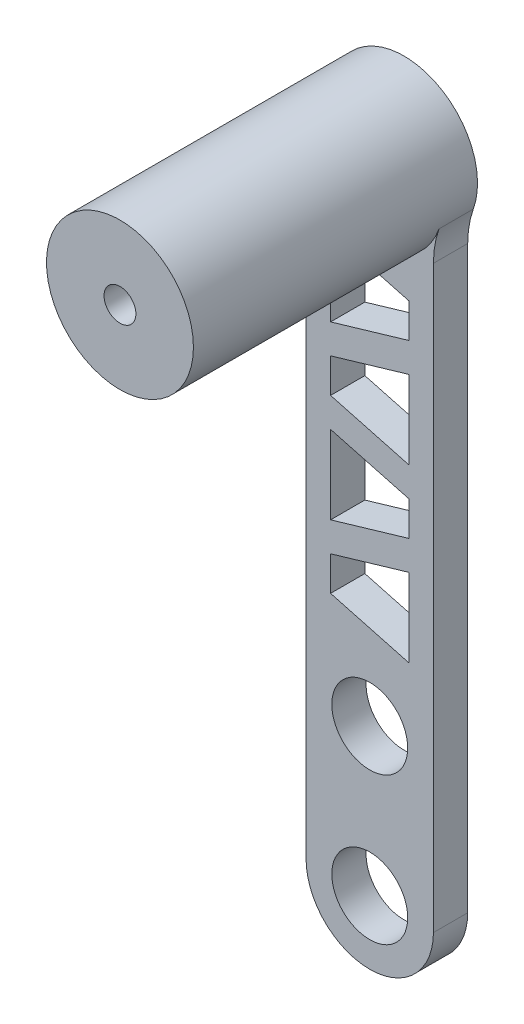
ISO-10303-21;
HEADER;
FILE_DESCRIPTION(('STEP AP214'),'2;1');
FILE_NAME('part.step','',(''),(''),'','','');
FILE_SCHEMA(('AUTOMOTIVE_DESIGN { 1 0 10303 214 1 1 1 1 }'));
ENDSEC;
DATA;
#1=APPLICATION_CONTEXT('core data for automotive mechanical design processes');
#2=APPLICATION_PROTOCOL_DEFINITION('international standard','automotive_design',2000,#1);
#3=PRODUCT_CONTEXT('',#1,'mechanical');
#4=PRODUCT('Part','Part','',(#3));
#5=PRODUCT_RELATED_PRODUCT_CATEGORY('part','',(#4));
#6=PRODUCT_DEFINITION_FORMATION('','',#4);
#7=PRODUCT_DEFINITION_CONTEXT('part definition',#1,'design');
#8=PRODUCT_DEFINITION('design','',#6,#7);
#9=PRODUCT_DEFINITION_SHAPE('','',#8);
#10=(LENGTH_UNIT() NAMED_UNIT(*) SI_UNIT(.MILLI.,.METRE.));
#11=(NAMED_UNIT(*) PLANE_ANGLE_UNIT() SI_UNIT($,.RADIAN.));
#12=(NAMED_UNIT(*) SI_UNIT($,.STERADIAN.) SOLID_ANGLE_UNIT());
#13=UNCERTAINTY_MEASURE_WITH_UNIT(LENGTH_MEASURE(1.E-05),#10,'distance_accuracy_value','');
#14=(GEOMETRIC_REPRESENTATION_CONTEXT(3) GLOBAL_UNCERTAINTY_ASSIGNED_CONTEXT((#13)) GLOBAL_UNIT_ASSIGNED_CONTEXT((#10,
#11,#12)) REPRESENTATION_CONTEXT('',''));
#15=CARTESIAN_POINT('',(0.,0.,0.));
#16=DIRECTION('',(0.,0.,1.));
#17=DIRECTION('',(1.,0.,0.));
#18=AXIS2_PLACEMENT_3D('',#15,#16,#17);
#19=CARTESIAN_POINT('',(31.8782180609369,65.8173692325044,7.));
#20=DIRECTION('',(0.,0.,-1.));
#21=DIRECTION('',(-1.,0.,0.));
#22=AXIS2_PLACEMENT_3D('',#19,#20,#21);
#23=PLANE('',#22);
#24=DIRECTION('',(0.,1.,0.));
#25=VECTOR('',#24,1.);
#26=CARTESIAN_POINT('',(6.8782180609373,14.6704669103968,7.));
#27=LINE('',#26,#25);
#28=CARTESIAN_POINT('',(6.8782180609373,14.6704669103968,7.));
#29=VERTEX_POINT('',#28);
#30=CARTESIAN_POINT('',(6.8782180609373,21.6704669103968,7.));
#31=VERTEX_POINT('',#30);
#32=EDGE_CURVE('E215',#29,#31,#27,.T.);
#33=ORIENTED_EDGE('',*,*,#32,.F.);
#34=DIRECTION('',(0.959252946392428,0.28254873002271,0.));
#35=VECTOR('',#34,1.);
#36=CARTESIAN_POINT('',(-9.1217819390627,9.95765398929479,7.));
#37=LINE('',#36,#35);
#38=CARTESIAN_POINT('',(-9.1217819390627,9.95765398929479,7.));
#39=VERTEX_POINT('',#38);
#40=EDGE_CURVE('E222',#39,#29,#37,.T.);
#41=ORIENTED_EDGE('',*,*,#40,.F.);
#42=DIRECTION('',(0.,-1.,0.));
#43=VECTOR('',#42,1.);
#44=CARTESIAN_POINT('',(-9.12178193906271,25.9576539892948,7.));
#45=LINE('',#44,#43);
#46=CARTESIAN_POINT('',(-9.12178193906271,25.9576539892948,7.));
#47=VERTEX_POINT('',#46);
#48=EDGE_CURVE('E220',#47,#39,#45,.T.);
#49=ORIENTED_EDGE('',*,*,#48,.F.);
#50=DIRECTION('',(-0.965925826289067,0.258819045102525,0.));
#51=VECTOR('',#50,1.);
#52=CARTESIAN_POINT('',(6.8782180609373,21.6704669103968,7.));
#53=LINE('',#52,#51);
#54=EDGE_CURVE('E217',#31,#47,#53,.T.);
#55=ORIENTED_EDGE('',*,*,#54,.F.);
#56=EDGE_LOOP('',(#33,#41,#49,#55));
#57=FACE_BOUND('',#56,.T.);
#58=DIRECTION('',(-0.959252946392428,-0.28254873002271,0.));
#59=VECTOR('',#58,1.);
#60=CARTESIAN_POINT('',(6.87821806093681,43.6704669103968,7.));
#61=LINE('',#60,#59);
#62=CARTESIAN_POINT('',(6.87821806093681,43.6704669103968,7.));
#63=VERTEX_POINT('',#62);
#64=CARTESIAN_POINT('',(-9.12178193906319,38.9576539892948,7.));
#65=VERTEX_POINT('',#64);
#66=EDGE_CURVE('E272',#63,#65,#61,.T.);
#67=ORIENTED_EDGE('',*,*,#66,.F.);
#68=DIRECTION('',(0.,1.,0.));
#69=VECTOR('',#68,1.);
#70=CARTESIAN_POINT('',(6.87821806093681,27.6704669103968,7.));
#71=LINE('',#70,#69);
#72=CARTESIAN_POINT('',(6.87821806093681,27.6704669103968,7.));
#73=VERTEX_POINT('',#72);
#74=EDGE_CURVE('E280',#73,#63,#71,.T.);
#75=ORIENTED_EDGE('',*,*,#74,.F.);
#76=DIRECTION('',(0.965925826289067,-0.258819045102525,0.));
#77=VECTOR('',#76,1.);
#78=CARTESIAN_POINT('',(-9.12178193906319,31.9576539892948,7.));
#79=LINE('',#78,#77);
#80=CARTESIAN_POINT('',(-9.12178193906319,31.9576539892948,7.));
#81=VERTEX_POINT('',#80);
#82=EDGE_CURVE('E277',#81,#73,#79,.T.);
#83=ORIENTED_EDGE('',*,*,#82,.F.);
#84=DIRECTION('',(0.,-1.,0.));
#85=VECTOR('',#84,1.);
#86=CARTESIAN_POINT('',(-9.12178193906319,38.9576539892948,7.));
#87=LINE('',#86,#85);
#88=EDGE_CURVE('E274',#65,#81,#87,.T.);
#89=ORIENTED_EDGE('',*,*,#88,.F.);
#90=EDGE_LOOP('',(#67,#75,#83,#89));
#91=FACE_BOUND('',#90,.T.);
#92=CARTESIAN_POINT('',(-1.12178193906306,-22.5207269778051,7.));
#93=DIRECTION('',(0.,0.,1.));
#94=DIRECTION('',(1.,0.,0.));
#95=AXIS2_PLACEMENT_3D('',#92,#93,#94);
#96=CIRCLE('',#95,7.75);
#97=CARTESIAN_POINT('',(6.62821806093695,-22.5207269778051,7.));
#98=VERTEX_POINT('',#97);
#99=EDGE_CURVE('E339',#98,#98,#96,.T.);
#100=ORIENTED_EDGE('',*,*,#99,.F.);
#101=EDGE_LOOP('',(#100));
#102=FACE_BOUND('',#101,.T.);
#103=CARTESIAN_POINT('',(-1.12178193906305,-52.5207269778051,7.));
#104=DIRECTION('',(0.,0.,1.));
#105=DIRECTION('',(1.,0.,0.));
#106=AXIS2_PLACEMENT_3D('',#103,#104,#105);
#107=CIRCLE('',#106,7.75);
#108=CARTESIAN_POINT('',(6.62821806093695,-52.5207269778051,7.));
#109=VERTEX_POINT('',#108);
#110=EDGE_CURVE('E345',#109,#109,#107,.T.);
#111=ORIENTED_EDGE('',*,*,#110,.F.);
#112=EDGE_LOOP('',(#111));
#113=FACE_BOUND('',#112,.T.);
#114=DIRECTION('',(-0.959252946392428,-0.28254873002271,0.));
#115=VECTOR('',#114,1.);
#116=CARTESIAN_POINT('',(6.87821806093693,8.67046691039676,7.));
#117=LINE('',#116,#115);
#118=CARTESIAN_POINT('',(6.87821806093693,8.67046691039676,7.));
#119=VERTEX_POINT('',#118);
#120=CARTESIAN_POINT('',(-9.12178193906307,3.95765398929479,7.));
#121=VERTEX_POINT('',#120);
#122=EDGE_CURVE('E303',#119,#121,#117,.T.);
#123=ORIENTED_EDGE('',*,*,#122,.F.);
#124=DIRECTION('',(0.,1.,0.));
#125=VECTOR('',#124,1.);
#126=CARTESIAN_POINT('',(6.87821806093693,-7.32953308960324,7.));
#127=LINE('',#126,#125);
#128=CARTESIAN_POINT('',(6.87821806093693,-7.32953308960324,7.));
#129=VERTEX_POINT('',#128);
#130=EDGE_CURVE('E311',#129,#119,#127,.T.);
#131=ORIENTED_EDGE('',*,*,#130,.F.);
#132=DIRECTION('',(0.965925826289067,-0.258819045102525,0.));
#133=VECTOR('',#132,1.);
#134=CARTESIAN_POINT('',(-9.12178193906307,-3.04234601070521,7.));
#135=LINE('',#134,#133);
#136=CARTESIAN_POINT('',(-9.12178193906307,-3.04234601070521,7.));
#137=VERTEX_POINT('',#136);
#138=EDGE_CURVE('E308',#137,#129,#135,.T.);
#139=ORIENTED_EDGE('',*,*,#138,.F.);
#140=DIRECTION('',(0.,-1.,0.));
#141=VECTOR('',#140,1.);
#142=CARTESIAN_POINT('',(-9.12178193906307,3.95765398929479,7.));
#143=LINE('',#142,#141);
#144=EDGE_CURVE('E305',#121,#137,#143,.T.);
#145=ORIENTED_EDGE('',*,*,#144,.F.);
#146=EDGE_LOOP('',(#123,#131,#139,#145));
#147=FACE_BOUND('',#146,.T.);
#148=DIRECTION('',(0.959252946392428,0.28254873002271,0.));
#149=VECTOR('',#148,1.);
#150=CARTESIAN_POINT('',(-9.12178193906307,44.9576539892948,7.));
#151=LINE('',#150,#149);
#152=CARTESIAN_POINT('',(-9.12178193906307,44.9576539892948,7.));
#153=VERTEX_POINT('',#152);
#154=CARTESIAN_POINT('',(6.87821806093693,49.6704669103968,7.));
#155=VERTEX_POINT('',#154);
#156=EDGE_CURVE('E241',#153,#155,#151,.T.);
#157=ORIENTED_EDGE('',*,*,#156,.F.);
#158=DIRECTION('',(0.,-1.,0.));
#159=VECTOR('',#158,1.);
#160=CARTESIAN_POINT('',(-9.12178193906307,60.9576539892948,7.));
#161=LINE('',#160,#159);
#162=CARTESIAN_POINT('',(-9.12178193906307,60.9576539892948,7.));
#163=VERTEX_POINT('',#162);
#164=EDGE_CURVE('E249',#163,#153,#161,.T.);
#165=ORIENTED_EDGE('',*,*,#164,.F.);
#166=DIRECTION('',(-0.965925826289067,0.258819045102525,0.));
#167=VECTOR('',#166,1.);
#168=CARTESIAN_POINT('',(6.87821806093693,56.6704669103968,7.));
#169=LINE('',#168,#167);
#170=CARTESIAN_POINT('',(6.87821806093693,56.6704669103968,7.));
#171=VERTEX_POINT('',#170);
#172=EDGE_CURVE('E246',#171,#163,#169,.T.);
#173=ORIENTED_EDGE('',*,*,#172,.F.);
#174=DIRECTION('',(0.,1.,0.));
#175=VECTOR('',#174,1.);
#176=CARTESIAN_POINT('',(6.87821806093693,49.6704669103968,7.));
#177=LINE('',#176,#175);
#178=EDGE_CURVE('E243',#155,#171,#177,.T.);
#179=ORIENTED_EDGE('',*,*,#178,.F.);
#180=EDGE_LOOP('',(#157,#165,#173,#179));
#181=FACE_BOUND('',#180,.T.);
#182=CARTESIAN_POINT('',(-1.12178193906307,77.4792730221949,7.));
#183=DIRECTION('',(0.,0.,1.));
#184=DIRECTION('',(1.,0.,0.));
#185=AXIS2_PLACEMENT_3D('',#182,#183,#184);
#186=CIRCLE('',#185,15.);
#187=CARTESIAN_POINT('',(-15.2646390819202,72.4813142551847,7.));
#188=VERTEX_POINT('',#187);
#189=CARTESIAN_POINT('',(13.0210752037941,72.4813142551847,7.));
#190=VERTEX_POINT('',#189);
#191=EDGE_CURVE('E200',#188,#190,#186,.T.);
#192=ORIENTED_EDGE('',*,*,#191,.F.);
#193=CARTESIAN_POINT('',(-34.1217819390631,65.8173692325043,7.));
#194=DIRECTION('',(0.,0.,-1.));
#195=DIRECTION('',(-1.,0.,0.));
#196=AXIS2_PLACEMENT_3D('',#193,#194,#195);
#197=CIRCLE('',#196,20.);
#198=CARTESIAN_POINT('',(-14.1217819390631,65.8173692325043,7.));
#199=VERTEX_POINT('',#198);
#200=EDGE_CURVE('E184',#188,#199,#197,.T.);
#201=ORIENTED_EDGE('',*,*,#200,.T.);
#202=DIRECTION('',(0.,-1.,0.));
#203=VECTOR('',#202,1.);
#204=CARTESIAN_POINT('',(-14.1217819390631,65.8173692325043,7.));
#205=LINE('',#204,#203);
#206=CARTESIAN_POINT('',(-14.121781939063,-52.5207269778051,7.));
#207=VERTEX_POINT('',#206);
#208=EDGE_CURVE('E193',#199,#207,#205,.T.);
#209=ORIENTED_EDGE('',*,*,#208,.T.);
#210=CARTESIAN_POINT('',(-1.12178193906305,-52.5207269778051,7.));
#211=DIRECTION('',(0.,0.,1.));
#212=DIRECTION('',(1.,0.,0.));
#213=AXIS2_PLACEMENT_3D('',#210,#211,#212);
#214=CIRCLE('',#213,13.);
#215=CARTESIAN_POINT('',(11.8782180609369,-52.5207269778051,7.));
#216=VERTEX_POINT('',#215);
#217=EDGE_CURVE('E354',#207,#216,#214,.T.);
#218=ORIENTED_EDGE('',*,*,#217,.T.);
#219=DIRECTION('',(0.,1.,0.));
#220=VECTOR('',#219,1.);
#221=CARTESIAN_POINT('',(11.8782180609369,65.8173692325044,7.));
#222=LINE('',#221,#220);
#223=CARTESIAN_POINT('',(11.8782180609369,65.8173692325044,7.));
#224=VERTEX_POINT('',#223);
#225=EDGE_CURVE('E356',#216,#224,#222,.T.);
#226=ORIENTED_EDGE('',*,*,#225,.T.);
#227=CARTESIAN_POINT('',(31.8782180609369,65.8173692325044,7.));
#228=DIRECTION('',(0.,0.,-1.));
#229=DIRECTION('',(-1.,0.,0.));
#230=AXIS2_PLACEMENT_3D('',#227,#228,#229);
#231=CIRCLE('',#230,20.);
#232=EDGE_CURVE('E194',#224,#190,#231,.T.);
#233=ORIENTED_EDGE('',*,*,#232,.T.);
#234=EDGE_LOOP('',(#192,#201,#209,#218,#226,#233));
#235=FACE_BOUND('',#234,.T.);
#236=ADVANCED_FACE('F33',(#57,#91,#102,#113,#147,#181,#235),#23,.F.);
#237=CARTESIAN_POINT('',(31.8782180609369,65.8173692325044,0.));
#238=DIRECTION('',(0.,0.,-1.));
#239=DIRECTION('',(-1.,0.,0.));
#240=AXIS2_PLACEMENT_3D('',#237,#238,#239);
#241=PLANE('',#240);
#242=CARTESIAN_POINT('',(-1.12178193906306,-22.5207269778051,0.));
#243=DIRECTION('',(0.,0.,1.));
#244=DIRECTION('',(1.,0.,0.));
#245=AXIS2_PLACEMENT_3D('',#242,#243,#244);
#246=CIRCLE('',#245,7.75);
#247=CARTESIAN_POINT('',(6.62821806093695,-22.5207269778051,0.));
#248=VERTEX_POINT('',#247);
#249=EDGE_CURVE('E338',#248,#248,#246,.T.);
#250=ORIENTED_EDGE('',*,*,#249,.T.);
#251=EDGE_LOOP('',(#250));
#252=FACE_BOUND('',#251,.T.);
#253=CARTESIAN_POINT('',(31.8782180609369,65.8173692325044,0.));
#254=DIRECTION('',(0.,0.,-1.));
#255=DIRECTION('',(-1.,0.,0.));
#256=AXIS2_PLACEMENT_3D('',#253,#254,#255);
#257=CIRCLE('',#256,20.);
#258=CARTESIAN_POINT('',(11.8782180609369,65.8173692325044,0.));
#259=VERTEX_POINT('',#258);
#260=CARTESIAN_POINT('',(13.0210752037941,72.4813142551847,0.));
#261=VERTEX_POINT('',#260);
#262=EDGE_CURVE('E348',#259,#261,#257,.T.);
#263=ORIENTED_EDGE('',*,*,#262,.F.);
#264=DIRECTION('',(0.,1.,0.));
#265=VECTOR('',#264,1.);
#266=CARTESIAN_POINT('',(11.8782180609369,65.8173692325044,0.));
#267=LINE('',#266,#265);
#268=CARTESIAN_POINT('',(11.8782180609369,-52.5207269778051,0.));
#269=VERTEX_POINT('',#268);
#270=EDGE_CURVE('E351',#269,#259,#267,.T.);
#271=ORIENTED_EDGE('',*,*,#270,.F.);
#272=CARTESIAN_POINT('',(-1.12178193906305,-52.5207269778051,0.));
#273=DIRECTION('',(0.,0.,1.));
#274=DIRECTION('',(1.,0.,0.));
#275=AXIS2_PLACEMENT_3D('',#272,#273,#274);
#276=CIRCLE('',#275,13.);
#277=CARTESIAN_POINT('',(-14.121781939063,-52.5207269778051,0.));
#278=VERTEX_POINT('',#277);
#279=EDGE_CURVE('E366',#278,#269,#276,.T.);
#280=ORIENTED_EDGE('',*,*,#279,.F.);
#281=DIRECTION('',(0.,-1.,0.));
#282=VECTOR('',#281,1.);
#283=CARTESIAN_POINT('',(-14.1217819390631,65.8173692325043,0.));
#284=LINE('',#283,#282);
#285=CARTESIAN_POINT('',(-14.1217819390631,65.8173692325043,0.));
#286=VERTEX_POINT('',#285);
#287=EDGE_CURVE('E364',#286,#278,#284,.T.);
#288=ORIENTED_EDGE('',*,*,#287,.F.);
#289=CARTESIAN_POINT('',(-34.1217819390631,65.8173692325043,0.));
#290=DIRECTION('',(0.,0.,-1.));
#291=DIRECTION('',(-1.,0.,0.));
#292=AXIS2_PLACEMENT_3D('',#289,#290,#291);
#293=CIRCLE('',#292,20.);
#294=CARTESIAN_POINT('',(-15.2646390819202,72.4813142551847,0.));
#295=VERTEX_POINT('',#294);
#296=EDGE_CURVE('E362',#295,#286,#293,.T.);
#297=ORIENTED_EDGE('',*,*,#296,.F.);
#298=CARTESIAN_POINT('',(-1.12178193906307,77.4792730221949,0.));
#299=DIRECTION('',(0.,0.,1.));
#300=DIRECTION('',(1.,0.,0.));
#301=AXIS2_PLACEMENT_3D('',#298,#299,#300);
#302=CIRCLE('',#301,15.);
#303=EDGE_CURVE('E201',#261,#295,#302,.T.);
#304=ORIENTED_EDGE('',*,*,#303,.F.);
#305=EDGE_LOOP('',(#263,#271,#280,#288,#297,#304));
#306=FACE_BOUND('',#305,.T.);
#307=CARTESIAN_POINT('',(-1.12178193906305,-52.5207269778051,0.));
#308=DIRECTION('',(0.,0.,1.));
#309=DIRECTION('',(1.,0.,0.));
#310=AXIS2_PLACEMENT_3D('',#307,#308,#309);
#311=CIRCLE('',#310,7.75);
#312=CARTESIAN_POINT('',(6.62821806093695,-52.5207269778051,0.));
#313=VERTEX_POINT('',#312);
#314=EDGE_CURVE('E342',#313,#313,#311,.T.);
#315=ORIENTED_EDGE('',*,*,#314,.T.);
#316=EDGE_LOOP('',(#315));
#317=FACE_BOUND('',#316,.T.);
#318=CARTESIAN_POINT('',(-1.12178193906307,77.4792730221949,0.));
#319=DIRECTION('',(0.,0.,1.));
#320=DIRECTION('',(1.,0.,0.));
#321=AXIS2_PLACEMENT_3D('',#318,#319,#320);
#322=CIRCLE('',#321,7.75000000000001);
#323=CARTESIAN_POINT('',(6.62821806093694,77.4792730221949,0.));
#324=VERTEX_POINT('',#323);
#325=EDGE_CURVE('E333',#324,#324,#322,.T.);
#326=ORIENTED_EDGE('',*,*,#325,.T.);
#327=EDGE_LOOP('',(#326));
#328=FACE_BOUND('',#327,.T.);
#329=DIRECTION('',(0.,1.,0.));
#330=VECTOR('',#329,1.);
#331=CARTESIAN_POINT('',(6.87821806093693,-7.32953308960324,0.));
#332=LINE('',#331,#330);
#333=CARTESIAN_POINT('',(6.87821806093693,-7.32953308960324,0.));
#334=VERTEX_POINT('',#333);
#335=CARTESIAN_POINT('',(6.87821806093693,8.67046691039676,0.));
#336=VERTEX_POINT('',#335);
#337=EDGE_CURVE('E306',#334,#336,#332,.T.);
#338=ORIENTED_EDGE('',*,*,#337,.T.);
#339=DIRECTION('',(-0.959252946392428,-0.28254873002271,0.));
#340=VECTOR('',#339,1.);
#341=CARTESIAN_POINT('',(6.87821806093693,8.67046691039676,0.));
#342=LINE('',#341,#340);
#343=CARTESIAN_POINT('',(-9.12178193906307,3.95765398929479,0.));
#344=VERTEX_POINT('',#343);
#345=EDGE_CURVE('E302',#336,#344,#342,.T.);
#346=ORIENTED_EDGE('',*,*,#345,.T.);
#347=DIRECTION('',(0.,-1.,0.));
#348=VECTOR('',#347,1.);
#349=CARTESIAN_POINT('',(-9.12178193906307,3.95765398929479,0.));
#350=LINE('',#349,#348);
#351=CARTESIAN_POINT('',(-9.12178193906307,-3.04234601070521,0.));
#352=VERTEX_POINT('',#351);
#353=EDGE_CURVE('E316',#344,#352,#350,.T.);
#354=ORIENTED_EDGE('',*,*,#353,.T.);
#355=DIRECTION('',(0.965925826289067,-0.258819045102525,0.));
#356=VECTOR('',#355,1.);
#357=CARTESIAN_POINT('',(-9.12178193906307,-3.04234601070521,0.));
#358=LINE('',#357,#356);
#359=EDGE_CURVE('E319',#352,#334,#358,.T.);
#360=ORIENTED_EDGE('',*,*,#359,.T.);
#361=EDGE_LOOP('',(#338,#346,#354,#360));
#362=FACE_BOUND('',#361,.T.);
#363=DIRECTION('',(0.,1.,0.));
#364=VECTOR('',#363,1.);
#365=CARTESIAN_POINT('',(6.87821806093681,27.6704669103968,0.));
#366=LINE('',#365,#364);
#367=CARTESIAN_POINT('',(6.87821806093681,27.6704669103968,0.));
#368=VERTEX_POINT('',#367);
#369=CARTESIAN_POINT('',(6.87821806093681,43.6704669103968,0.));
#370=VERTEX_POINT('',#369);
#371=EDGE_CURVE('E275',#368,#370,#366,.T.);
#372=ORIENTED_EDGE('',*,*,#371,.T.);
#373=DIRECTION('',(-0.959252946392428,-0.28254873002271,0.));
#374=VECTOR('',#373,1.);
#375=CARTESIAN_POINT('',(6.87821806093681,43.6704669103968,0.));
#376=LINE('',#375,#374);
#377=CARTESIAN_POINT('',(-9.12178193906319,38.9576539892948,0.));
#378=VERTEX_POINT('',#377);
#379=EDGE_CURVE('E271',#370,#378,#376,.T.);
#380=ORIENTED_EDGE('',*,*,#379,.T.);
#381=DIRECTION('',(0.,-1.,0.));
#382=VECTOR('',#381,1.);
#383=CARTESIAN_POINT('',(-9.12178193906319,38.9576539892948,0.));
#384=LINE('',#383,#382);
#385=CARTESIAN_POINT('',(-9.12178193906319,31.9576539892948,0.));
#386=VERTEX_POINT('',#385);
#387=EDGE_CURVE('E285',#378,#386,#384,.T.);
#388=ORIENTED_EDGE('',*,*,#387,.T.);
#389=DIRECTION('',(0.965925826289067,-0.258819045102525,0.));
#390=VECTOR('',#389,1.);
#391=CARTESIAN_POINT('',(-9.12178193906319,31.9576539892948,0.));
#392=LINE('',#391,#390);
#393=EDGE_CURVE('E288',#386,#368,#392,.T.);
#394=ORIENTED_EDGE('',*,*,#393,.T.);
#395=EDGE_LOOP('',(#372,#380,#388,#394));
#396=FACE_BOUND('',#395,.T.);
#397=DIRECTION('',(0.,-1.,0.));
#398=VECTOR('',#397,1.);
#399=CARTESIAN_POINT('',(-9.12178193906307,60.9576539892948,0.));
#400=LINE('',#399,#398);
#401=CARTESIAN_POINT('',(-9.12178193906307,60.9576539892948,0.));
#402=VERTEX_POINT('',#401);
#403=CARTESIAN_POINT('',(-9.12178193906307,44.9576539892948,0.));
#404=VERTEX_POINT('',#403);
#405=EDGE_CURVE('E244',#402,#404,#400,.T.);
#406=ORIENTED_EDGE('',*,*,#405,.T.);
#407=DIRECTION('',(0.959252946392428,0.28254873002271,0.));
#408=VECTOR('',#407,1.);
#409=CARTESIAN_POINT('',(-9.12178193906307,44.9576539892948,0.));
#410=LINE('',#409,#408);
#411=CARTESIAN_POINT('',(6.87821806093693,49.6704669103968,0.));
#412=VERTEX_POINT('',#411);
#413=EDGE_CURVE('E240',#404,#412,#410,.T.);
#414=ORIENTED_EDGE('',*,*,#413,.T.);
#415=DIRECTION('',(0.,1.,0.));
#416=VECTOR('',#415,1.);
#417=CARTESIAN_POINT('',(6.87821806093693,49.6704669103968,0.));
#418=LINE('',#417,#416);
#419=CARTESIAN_POINT('',(6.87821806093693,56.6704669103968,0.));
#420=VERTEX_POINT('',#419);
#421=EDGE_CURVE('E254',#412,#420,#418,.T.);
#422=ORIENTED_EDGE('',*,*,#421,.T.);
#423=DIRECTION('',(-0.965925826289067,0.258819045102525,0.));
#424=VECTOR('',#423,1.);
#425=CARTESIAN_POINT('',(6.87821806093693,56.6704669103968,0.));
#426=LINE('',#425,#424);
#427=EDGE_CURVE('E257',#420,#402,#426,.T.);
#428=ORIENTED_EDGE('',*,*,#427,.T.);
#429=EDGE_LOOP('',(#406,#414,#422,#428));
#430=FACE_BOUND('',#429,.T.);
#431=DIRECTION('',(0.959252946392428,0.28254873002271,0.));
#432=VECTOR('',#431,1.);
#433=CARTESIAN_POINT('',(-9.1217819390627,9.95765398929479,0.));
#434=LINE('',#433,#432);
#435=CARTESIAN_POINT('',(-9.1217819390627,9.95765398929479,0.));
#436=VERTEX_POINT('',#435);
#437=CARTESIAN_POINT('',(6.8782180609373,14.6704669103968,0.));
#438=VERTEX_POINT('',#437);
#439=EDGE_CURVE('E218',#436,#438,#434,.T.);
#440=ORIENTED_EDGE('',*,*,#439,.T.);
#441=DIRECTION('',(0.,1.,0.));
#442=VECTOR('',#441,1.);
#443=CARTESIAN_POINT('',(6.8782180609373,14.6704669103968,0.));
#444=LINE('',#443,#442);
#445=CARTESIAN_POINT('',(6.8782180609373,21.6704669103968,0.));
#446=VERTEX_POINT('',#445);
#447=EDGE_CURVE('E56',#438,#446,#444,.T.);
#448=ORIENTED_EDGE('',*,*,#447,.T.);
#449=DIRECTION('',(-0.965925826289067,0.258819045102525,0.));
#450=VECTOR('',#449,1.);
#451=CARTESIAN_POINT('',(6.8782180609373,21.6704669103968,0.));
#452=LINE('',#451,#450);
#453=CARTESIAN_POINT('',(-9.12178193906271,25.9576539892948,0.));
#454=VERTEX_POINT('',#453);
#455=EDGE_CURVE('E226',#446,#454,#452,.T.);
#456=ORIENTED_EDGE('',*,*,#455,.T.);
#457=DIRECTION('',(0.,-1.,0.));
#458=VECTOR('',#457,1.);
#459=CARTESIAN_POINT('',(-9.12178193906271,25.9576539892948,0.));
#460=LINE('',#459,#458);
#461=EDGE_CURVE('E229',#454,#436,#460,.T.);
#462=ORIENTED_EDGE('',*,*,#461,.T.);
#463=EDGE_LOOP('',(#440,#448,#456,#462));
#464=FACE_BOUND('',#463,.T.);
#465=ADVANCED_FACE('F384',(#252,#306,#317,#328,#362,#396,#430,#464),#241,.T.);
#466=CARTESIAN_POINT('',(31.8782180609369,65.8173692325044,7.));
#467=DIRECTION('',(0.,0.,-1.));
#468=DIRECTION('',(-1.,0.,0.));
#469=AXIS2_PLACEMENT_3D('',#466,#467,#468);
#470=CYLINDRICAL_SURFACE('',#469,20.);
#471=ORIENTED_EDGE('',*,*,#262,.T.);
#472=DIRECTION('',(0.,0.,-1.));
#473=VECTOR('',#472,1.);
#474=CARTESIAN_POINT('',(13.0210752037941,72.4813142551847,7.));
#475=LINE('',#474,#473);
#476=EDGE_CURVE('E11',#190,#261,#475,.T.);
#477=ORIENTED_EDGE('',*,*,#476,.F.);
#478=ORIENTED_EDGE('',*,*,#232,.F.);
#479=DIRECTION('',(0.,0.,-1.));
#480=VECTOR('',#479,1.);
#481=CARTESIAN_POINT('',(11.8782180609369,65.8173692325044,7.));
#482=LINE('',#481,#480);
#483=EDGE_CURVE('E358',#224,#259,#482,.T.);
#484=ORIENTED_EDGE('',*,*,#483,.T.);
#485=EDGE_LOOP('',(#471,#477,#478,#484));
#486=FACE_BOUND('',#485,.T.);
#487=ADVANCED_FACE('F35',(#486),#470,.F.);
#488=CARTESIAN_POINT('',(-1.12178193906307,77.4792730221949,7.));
#489=DIRECTION('',(0.,0.,-1.));
#490=DIRECTION('',(-1.,0.,0.));
#491=AXIS2_PLACEMENT_3D('',#488,#489,#490);
#492=CYLINDRICAL_SURFACE('',#491,15.);
#493=ORIENTED_EDGE('',*,*,#303,.T.);
#494=DIRECTION('',(0.,0.,-1.));
#495=VECTOR('',#494,1.);
#496=CARTESIAN_POINT('',(-15.2646390819202,72.4813142551847,7.));
#497=LINE('',#496,#495);
#498=EDGE_CURVE('E41',#188,#295,#497,.T.);
#499=ORIENTED_EDGE('',*,*,#498,.F.);
#500=ORIENTED_EDGE('',*,*,#191,.T.);
#501=ORIENTED_EDGE('',*,*,#476,.T.);
#502=EDGE_LOOP('',(#493,#499,#500,#501));
#503=FACE_BOUND('',#502,.T.);
#504=CARTESIAN_POINT('',(-1.12178193906307,77.4792730221949,58.));
#505=DIRECTION('',(0.,0.,1.));
#506=DIRECTION('',(1.,0.,0.));
#507=AXIS2_PLACEMENT_3D('',#504,#505,#506);
#508=CIRCLE('',#507,15.);
#509=CARTESIAN_POINT('',(13.8782180609369,77.4792730221949,58.));
#510=VERTEX_POINT('',#509);
#511=EDGE_CURVE('E204',#510,#510,#508,.T.);
#512=ORIENTED_EDGE('',*,*,#511,.F.);
#513=EDGE_LOOP('',(#512));
#514=FACE_BOUND('',#513,.T.);
#515=ADVANCED_FACE('F198',(#503,#514),#492,.T.);
#516=CARTESIAN_POINT('',(-34.1217819390631,65.8173692325043,7.));
#517=DIRECTION('',(0.,0.,-1.));
#518=DIRECTION('',(-1.,0.,0.));
#519=AXIS2_PLACEMENT_3D('',#516,#517,#518);
#520=CYLINDRICAL_SURFACE('',#519,20.);
#521=ORIENTED_EDGE('',*,*,#296,.T.);
#522=DIRECTION('',(0.,0.,-1.));
#523=VECTOR('',#522,1.);
#524=CARTESIAN_POINT('',(-14.1217819390631,65.8173692325043,7.));
#525=LINE('',#524,#523);
#526=EDGE_CURVE('E189',#199,#286,#525,.T.);
#527=ORIENTED_EDGE('',*,*,#526,.F.);
#528=ORIENTED_EDGE('',*,*,#200,.F.);
#529=ORIENTED_EDGE('',*,*,#498,.T.);
#530=EDGE_LOOP('',(#521,#527,#528,#529));
#531=FACE_BOUND('',#530,.T.);
#532=ADVANCED_FACE('F186',(#531),#520,.F.);
#533=CARTESIAN_POINT('',(-14.1217819390631,65.8173692325043,7.));
#534=DIRECTION('',(1.,0.,0.));
#535=DIRECTION('',(0.,1.,0.));
#536=AXIS2_PLACEMENT_3D('',#533,#534,#535);
#537=PLANE('',#536);
#538=ORIENTED_EDGE('',*,*,#287,.T.);
#539=DIRECTION('',(0.,0.,-1.));
#540=VECTOR('',#539,1.);
#541=CARTESIAN_POINT('',(-14.121781939063,-52.5207269778051,7.));
#542=LINE('',#541,#540);
#543=EDGE_CURVE('E374',#207,#278,#542,.T.);
#544=ORIENTED_EDGE('',*,*,#543,.F.);
#545=ORIENTED_EDGE('',*,*,#208,.F.);
#546=ORIENTED_EDGE('',*,*,#526,.T.);
#547=EDGE_LOOP('',(#538,#544,#545,#546));
#548=FACE_BOUND('',#547,.T.);
#549=ADVANCED_FACE('F379',(#548),#537,.F.);
#550=CARTESIAN_POINT('',(-1.12178193906305,-52.5207269778051,7.));
#551=DIRECTION('',(0.,0.,-1.));
#552=DIRECTION('',(-1.,0.,0.));
#553=AXIS2_PLACEMENT_3D('',#550,#551,#552);
#554=CYLINDRICAL_SURFACE('',#553,13.);
#555=ORIENTED_EDGE('',*,*,#279,.T.);
#556=DIRECTION('',(0.,0.,-1.));
#557=VECTOR('',#556,1.);
#558=CARTESIAN_POINT('',(11.8782180609369,-52.5207269778051,7.));
#559=LINE('',#558,#557);
#560=EDGE_CURVE('E371',#216,#269,#559,.T.);
#561=ORIENTED_EDGE('',*,*,#560,.F.);
#562=ORIENTED_EDGE('',*,*,#217,.F.);
#563=ORIENTED_EDGE('',*,*,#543,.T.);
#564=EDGE_LOOP('',(#555,#561,#562,#563));
#565=FACE_BOUND('',#564,.T.);
#566=ADVANCED_FACE('F389',(#565),#554,.T.);
#567=CARTESIAN_POINT('',(11.8782180609369,65.8173692325044,7.));
#568=DIRECTION('',(-1.,0.,0.));
#569=DIRECTION('',(0.,-1.,0.));
#570=AXIS2_PLACEMENT_3D('',#567,#568,#569);
#571=PLANE('',#570);
#572=ORIENTED_EDGE('',*,*,#270,.T.);
#573=ORIENTED_EDGE('',*,*,#483,.F.);
#574=ORIENTED_EDGE('',*,*,#225,.F.);
#575=ORIENTED_EDGE('',*,*,#560,.T.);
#576=EDGE_LOOP('',(#572,#573,#574,#575));
#577=FACE_BOUND('',#576,.T.);
#578=ADVANCED_FACE('F393',(#577),#571,.F.);
#579=CARTESIAN_POINT('',(-1.12178193906305,-52.5207269778051,7.));
#580=DIRECTION('',(0.,0.,-1.));
#581=DIRECTION('',(-1.,0.,0.));
#582=AXIS2_PLACEMENT_3D('',#579,#580,#581);
#583=CYLINDRICAL_SURFACE('',#582,7.75);
#584=ORIENTED_EDGE('',*,*,#110,.T.);
#585=EDGE_LOOP('',(#584));
#586=FACE_BOUND('',#585,.T.);
#587=ORIENTED_EDGE('',*,*,#314,.F.);
#588=EDGE_LOOP('',(#587));
#589=FACE_BOUND('',#588,.T.);
#590=ADVANCED_FACE('F411',(#586,#589),#583,.F.);
#591=CARTESIAN_POINT('',(-1.12178193906306,-22.5207269778051,7.));
#592=DIRECTION('',(0.,0.,-1.));
#593=DIRECTION('',(-1.,0.,0.));
#594=AXIS2_PLACEMENT_3D('',#591,#592,#593);
#595=CYLINDRICAL_SURFACE('',#594,7.75);
#596=ORIENTED_EDGE('',*,*,#99,.T.);
#597=EDGE_LOOP('',(#596));
#598=FACE_BOUND('',#597,.T.);
#599=ORIENTED_EDGE('',*,*,#249,.F.);
#600=EDGE_LOOP('',(#599));
#601=FACE_BOUND('',#600,.T.);
#602=ADVANCED_FACE('F444',(#598,#601),#595,.F.);
#603=CARTESIAN_POINT('',(-1.12178193906307,77.4792730221949,7.));
#604=DIRECTION('',(0.,0.,-1.));
#605=DIRECTION('',(-1.,0.,0.));
#606=AXIS2_PLACEMENT_3D('',#603,#604,#605);
#607=CYLINDRICAL_SURFACE('',#606,7.75000000000001);
#608=CARTESIAN_POINT('',(-1.12178193906307,77.4792730221949,7.));
#609=DIRECTION('',(0.,0.,1.));
#610=DIRECTION('',(1.,0.,0.));
#611=AXIS2_PLACEMENT_3D('',#608,#609,#610);
#612=CIRCLE('',#611,7.75000000000001);
#613=CARTESIAN_POINT('',(6.62821806093694,77.4792730221949,7.));
#614=VERTEX_POINT('',#613);
#615=EDGE_CURVE('E208',#614,#614,#612,.T.);
#616=ORIENTED_EDGE('',*,*,#615,.T.);
#617=EDGE_LOOP('',(#616));
#618=FACE_BOUND('',#617,.T.);
#619=ORIENTED_EDGE('',*,*,#325,.F.);
#620=EDGE_LOOP('',(#619));
#621=FACE_BOUND('',#620,.T.);
#622=ADVANCED_FACE('F451',(#618,#621),#607,.F.);
#623=CARTESIAN_POINT('',(6.87821806093693,8.67046691039676,7.));
#624=DIRECTION('',(0.28254873002271,-0.959252946392428,0.));
#625=DIRECTION('',(0.959252946392428,0.28254873002271,0.));
#626=AXIS2_PLACEMENT_3D('',#623,#624,#625);
#627=PLANE('',#626);
#628=ORIENTED_EDGE('',*,*,#345,.F.);
#629=DIRECTION('',(0.,0.,-1.));
#630=VECTOR('',#629,1.);
#631=CARTESIAN_POINT('',(6.87821806093693,8.67046691039676,7.));
#632=LINE('',#631,#630);
#633=EDGE_CURVE('E313',#119,#336,#632,.T.);
#634=ORIENTED_EDGE('',*,*,#633,.F.);
#635=ORIENTED_EDGE('',*,*,#122,.T.);
#636=DIRECTION('',(0.,0.,-1.));
#637=VECTOR('',#636,1.);
#638=CARTESIAN_POINT('',(-9.12178193906307,3.95765398929479,7.));
#639=LINE('',#638,#637);
#640=EDGE_CURVE('E330',#121,#344,#639,.T.);
#641=ORIENTED_EDGE('',*,*,#640,.T.);
#642=EDGE_LOOP('',(#628,#634,#635,#641));
#643=FACE_BOUND('',#642,.T.);
#644=ADVANCED_FACE('F458',(#643),#627,.T.);
#645=CARTESIAN_POINT('',(-9.12178193906307,3.95765398929479,7.));
#646=DIRECTION('',(1.,0.,0.));
#647=DIRECTION('',(0.,0.,-1.));
#648=AXIS2_PLACEMENT_3D('',#645,#646,#647);
#649=PLANE('',#648);
#650=ORIENTED_EDGE('',*,*,#353,.F.);
#651=ORIENTED_EDGE('',*,*,#640,.F.);
#652=ORIENTED_EDGE('',*,*,#144,.T.);
#653=DIRECTION('',(0.,0.,-1.));
#654=VECTOR('',#653,1.);
#655=CARTESIAN_POINT('',(-9.12178193906307,-3.04234601070521,7.));
#656=LINE('',#655,#654);
#657=EDGE_CURVE('E328',#137,#352,#656,.T.);
#658=ORIENTED_EDGE('',*,*,#657,.T.);
#659=EDGE_LOOP('',(#650,#651,#652,#658));
#660=FACE_BOUND('',#659,.T.);
#661=ADVANCED_FACE('F466',(#660),#649,.T.);
#662=CARTESIAN_POINT('',(-9.12178193906307,-3.04234601070521,7.));
#663=DIRECTION('',(0.258819045102525,0.965925826289067,0.));
#664=DIRECTION('',(-0.965925826289067,0.258819045102525,0.));
#665=AXIS2_PLACEMENT_3D('',#662,#663,#664);
#666=PLANE('',#665);
#667=ORIENTED_EDGE('',*,*,#359,.F.);
#668=ORIENTED_EDGE('',*,*,#657,.F.);
#669=ORIENTED_EDGE('',*,*,#138,.T.);
#670=DIRECTION('',(0.,0.,-1.));
#671=VECTOR('',#670,1.);
#672=CARTESIAN_POINT('',(6.87821806093693,-7.32953308960324,7.));
#673=LINE('',#672,#671);
#674=EDGE_CURVE('E326',#129,#334,#673,.T.);
#675=ORIENTED_EDGE('',*,*,#674,.T.);
#676=EDGE_LOOP('',(#667,#668,#669,#675));
#677=FACE_BOUND('',#676,.T.);
#678=ADVANCED_FACE('F474',(#677),#666,.T.);
#679=CARTESIAN_POINT('',(6.87821806093693,-7.32953308960324,7.));
#680=DIRECTION('',(-1.,0.,0.));
#681=DIRECTION('',(0.,-1.,0.));
#682=AXIS2_PLACEMENT_3D('',#679,#680,#681);
#683=PLANE('',#682);
#684=ORIENTED_EDGE('',*,*,#337,.F.);
#685=ORIENTED_EDGE('',*,*,#674,.F.);
#686=ORIENTED_EDGE('',*,*,#130,.T.);
#687=ORIENTED_EDGE('',*,*,#633,.T.);
#688=EDGE_LOOP('',(#684,#685,#686,#687));
#689=FACE_BOUND('',#688,.T.);
#690=ADVANCED_FACE('F482',(#689),#683,.T.);
#691=CARTESIAN_POINT('',(6.87821806093681,43.6704669103968,7.));
#692=DIRECTION('',(0.28254873002271,-0.959252946392428,0.));
#693=DIRECTION('',(0.959252946392428,0.28254873002271,0.));
#694=AXIS2_PLACEMENT_3D('',#691,#692,#693);
#695=PLANE('',#694);
#696=ORIENTED_EDGE('',*,*,#379,.F.);
#697=DIRECTION('',(0.,0.,-1.));
#698=VECTOR('',#697,1.);
#699=CARTESIAN_POINT('',(6.87821806093681,43.6704669103968,7.));
#700=LINE('',#699,#698);
#701=EDGE_CURVE('E282',#63,#370,#700,.T.);
#702=ORIENTED_EDGE('',*,*,#701,.F.);
#703=ORIENTED_EDGE('',*,*,#66,.T.);
#704=DIRECTION('',(0.,0.,-1.));
#705=VECTOR('',#704,1.);
#706=CARTESIAN_POINT('',(-9.12178193906319,38.9576539892948,7.));
#707=LINE('',#706,#705);
#708=EDGE_CURVE('E299',#65,#378,#707,.T.);
#709=ORIENTED_EDGE('',*,*,#708,.T.);
#710=EDGE_LOOP('',(#696,#702,#703,#709));
#711=FACE_BOUND('',#710,.T.);
#712=ADVANCED_FACE('F490',(#711),#695,.T.);
#713=CARTESIAN_POINT('',(-9.12178193906319,38.9576539892948,7.));
#714=DIRECTION('',(1.,0.,0.));
#715=DIRECTION('',(0.,0.,-1.));
#716=AXIS2_PLACEMENT_3D('',#713,#714,#715);
#717=PLANE('',#716);
#718=ORIENTED_EDGE('',*,*,#387,.F.);
#719=ORIENTED_EDGE('',*,*,#708,.F.);
#720=ORIENTED_EDGE('',*,*,#88,.T.);
#721=DIRECTION('',(0.,0.,-1.));
#722=VECTOR('',#721,1.);
#723=CARTESIAN_POINT('',(-9.12178193906319,31.9576539892948,7.));
#724=LINE('',#723,#722);
#725=EDGE_CURVE('E297',#81,#386,#724,.T.);
#726=ORIENTED_EDGE('',*,*,#725,.T.);
#727=EDGE_LOOP('',(#718,#719,#720,#726));
#728=FACE_BOUND('',#727,.T.);
#729=ADVANCED_FACE('F498',(#728),#717,.T.);
#730=CARTESIAN_POINT('',(-9.12178193906319,31.9576539892948,7.));
#731=DIRECTION('',(0.258819045102525,0.965925826289067,0.));
#732=DIRECTION('',(-0.965925826289067,0.258819045102525,0.));
#733=AXIS2_PLACEMENT_3D('',#730,#731,#732);
#734=PLANE('',#733);
#735=ORIENTED_EDGE('',*,*,#393,.F.);
#736=ORIENTED_EDGE('',*,*,#725,.F.);
#737=ORIENTED_EDGE('',*,*,#82,.T.);
#738=DIRECTION('',(0.,0.,-1.));
#739=VECTOR('',#738,1.);
#740=CARTESIAN_POINT('',(6.87821806093681,27.6704669103968,7.));
#741=LINE('',#740,#739);
#742=EDGE_CURVE('E295',#73,#368,#741,.T.);
#743=ORIENTED_EDGE('',*,*,#742,.T.);
#744=EDGE_LOOP('',(#735,#736,#737,#743));
#745=FACE_BOUND('',#744,.T.);
#746=ADVANCED_FACE('F506',(#745),#734,.T.);
#747=CARTESIAN_POINT('',(6.87821806093681,27.6704669103968,7.));
#748=DIRECTION('',(-1.,0.,0.));
#749=DIRECTION('',(0.,-1.,0.));
#750=AXIS2_PLACEMENT_3D('',#747,#748,#749);
#751=PLANE('',#750);
#752=ORIENTED_EDGE('',*,*,#371,.F.);
#753=ORIENTED_EDGE('',*,*,#742,.F.);
#754=ORIENTED_EDGE('',*,*,#74,.T.);
#755=ORIENTED_EDGE('',*,*,#701,.T.);
#756=EDGE_LOOP('',(#752,#753,#754,#755));
#757=FACE_BOUND('',#756,.T.);
#758=ADVANCED_FACE('F514',(#757),#751,.T.);
#759=CARTESIAN_POINT('',(-9.12178193906307,44.9576539892948,7.));
#760=DIRECTION('',(-0.28254873002271,0.959252946392428,0.));
#761=DIRECTION('',(-0.959252946392428,-0.28254873002271,0.));
#762=AXIS2_PLACEMENT_3D('',#759,#760,#761);
#763=PLANE('',#762);
#764=ORIENTED_EDGE('',*,*,#413,.F.);
#765=DIRECTION('',(0.,0.,-1.));
#766=VECTOR('',#765,1.);
#767=CARTESIAN_POINT('',(-9.12178193906307,44.9576539892948,7.));
#768=LINE('',#767,#766);
#769=EDGE_CURVE('E251',#153,#404,#768,.T.);
#770=ORIENTED_EDGE('',*,*,#769,.F.);
#771=ORIENTED_EDGE('',*,*,#156,.T.);
#772=DIRECTION('',(0.,0.,-1.));
#773=VECTOR('',#772,1.);
#774=CARTESIAN_POINT('',(6.87821806093693,49.6704669103968,7.));
#775=LINE('',#774,#773);
#776=EDGE_CURVE('E268',#155,#412,#775,.T.);
#777=ORIENTED_EDGE('',*,*,#776,.T.);
#778=EDGE_LOOP('',(#764,#770,#771,#777));
#779=FACE_BOUND('',#778,.T.);
#780=ADVANCED_FACE('F522',(#779),#763,.T.);
#781=CARTESIAN_POINT('',(6.87821806093693,49.6704669103968,7.));
#782=DIRECTION('',(-1.,0.,0.));
#783=DIRECTION('',(0.,0.,1.));
#784=AXIS2_PLACEMENT_3D('',#781,#782,#783);
#785=PLANE('',#784);
#786=ORIENTED_EDGE('',*,*,#421,.F.);
#787=ORIENTED_EDGE('',*,*,#776,.F.);
#788=ORIENTED_EDGE('',*,*,#178,.T.);
#789=DIRECTION('',(0.,0.,-1.));
#790=VECTOR('',#789,1.);
#791=CARTESIAN_POINT('',(6.87821806093693,56.6704669103968,7.));
#792=LINE('',#791,#790);
#793=EDGE_CURVE('E266',#171,#420,#792,.T.);
#794=ORIENTED_EDGE('',*,*,#793,.T.);
#795=EDGE_LOOP('',(#786,#787,#788,#794));
#796=FACE_BOUND('',#795,.T.);
#797=ADVANCED_FACE('F530',(#796),#785,.T.);
#798=CARTESIAN_POINT('',(6.87821806093693,56.6704669103968,7.));
#799=DIRECTION('',(-0.258819045102525,-0.965925826289067,0.));
#800=DIRECTION('',(0.965925826289067,-0.258819045102525,0.));
#801=AXIS2_PLACEMENT_3D('',#798,#799,#800);
#802=PLANE('',#801);
#803=ORIENTED_EDGE('',*,*,#427,.F.);
#804=ORIENTED_EDGE('',*,*,#793,.F.);
#805=ORIENTED_EDGE('',*,*,#172,.T.);
#806=DIRECTION('',(0.,0.,-1.));
#807=VECTOR('',#806,1.);
#808=CARTESIAN_POINT('',(-9.12178193906307,60.9576539892948,7.));
#809=LINE('',#808,#807);
#810=EDGE_CURVE('E264',#163,#402,#809,.T.);
#811=ORIENTED_EDGE('',*,*,#810,.T.);
#812=EDGE_LOOP('',(#803,#804,#805,#811));
#813=FACE_BOUND('',#812,.T.);
#814=ADVANCED_FACE('F538',(#813),#802,.T.);
#815=CARTESIAN_POINT('',(-9.12178193906307,60.9576539892948,7.));
#816=DIRECTION('',(1.,0.,0.));
#817=DIRECTION('',(0.,1.,0.));
#818=AXIS2_PLACEMENT_3D('',#815,#816,#817);
#819=PLANE('',#818);
#820=ORIENTED_EDGE('',*,*,#405,.F.);
#821=ORIENTED_EDGE('',*,*,#810,.F.);
#822=ORIENTED_EDGE('',*,*,#164,.T.);
#823=ORIENTED_EDGE('',*,*,#769,.T.);
#824=EDGE_LOOP('',(#820,#821,#822,#823));
#825=FACE_BOUND('',#824,.T.);
#826=ADVANCED_FACE('F546',(#825),#819,.T.);
#827=CARTESIAN_POINT('',(6.8782180609373,14.6704669103968,7.));
#828=DIRECTION('',(-1.,0.,0.));
#829=DIRECTION('',(0.,0.,1.));
#830=AXIS2_PLACEMENT_3D('',#827,#828,#829);
#831=PLANE('',#830);
#832=ORIENTED_EDGE('',*,*,#447,.F.);
#833=DIRECTION('',(0.,0.,-1.));
#834=VECTOR('',#833,1.);
#835=CARTESIAN_POINT('',(6.8782180609373,14.6704669103968,7.));
#836=LINE('',#835,#834);
#837=EDGE_CURVE('E224',#29,#438,#836,.T.);
#838=ORIENTED_EDGE('',*,*,#837,.F.);
#839=ORIENTED_EDGE('',*,*,#32,.T.);
#840=DIRECTION('',(0.,0.,-1.));
#841=VECTOR('',#840,1.);
#842=CARTESIAN_POINT('',(6.8782180609373,21.6704669103968,7.));
#843=LINE('',#842,#841);
#844=EDGE_CURVE('E238',#31,#446,#843,.T.);
#845=ORIENTED_EDGE('',*,*,#844,.T.);
#846=EDGE_LOOP('',(#832,#838,#839,#845));
#847=FACE_BOUND('',#846,.T.);
#848=ADVANCED_FACE('F554',(#847),#831,.T.);
#849=CARTESIAN_POINT('',(6.8782180609373,21.6704669103968,7.));
#850=DIRECTION('',(-0.258819045102525,-0.965925826289067,0.));
#851=DIRECTION('',(0.965925826289067,-0.258819045102525,0.));
#852=AXIS2_PLACEMENT_3D('',#849,#850,#851);
#853=PLANE('',#852);
#854=ORIENTED_EDGE('',*,*,#455,.F.);
#855=ORIENTED_EDGE('',*,*,#844,.F.);
#856=ORIENTED_EDGE('',*,*,#54,.T.);
#857=DIRECTION('',(0.,0.,-1.));
#858=VECTOR('',#857,1.);
#859=CARTESIAN_POINT('',(-9.12178193906271,25.9576539892948,7.));
#860=LINE('',#859,#858);
#861=EDGE_CURVE('E236',#47,#454,#860,.T.);
#862=ORIENTED_EDGE('',*,*,#861,.T.);
#863=EDGE_LOOP('',(#854,#855,#856,#862));
#864=FACE_BOUND('',#863,.T.);
#865=ADVANCED_FACE('F562',(#864),#853,.T.);
#866=CARTESIAN_POINT('',(-9.12178193906271,25.9576539892948,7.));
#867=DIRECTION('',(1.,0.,0.));
#868=DIRECTION('',(0.,1.,0.));
#869=AXIS2_PLACEMENT_3D('',#866,#867,#868);
#870=PLANE('',#869);
#871=ORIENTED_EDGE('',*,*,#461,.F.);
#872=ORIENTED_EDGE('',*,*,#861,.F.);
#873=ORIENTED_EDGE('',*,*,#48,.T.);
#874=DIRECTION('',(0.,0.,-1.));
#875=VECTOR('',#874,1.);
#876=CARTESIAN_POINT('',(-9.1217819390627,9.95765398929479,7.));
#877=LINE('',#876,#875);
#878=EDGE_CURVE('E48',#39,#436,#877,.T.);
#879=ORIENTED_EDGE('',*,*,#878,.T.);
#880=EDGE_LOOP('',(#871,#872,#873,#879));
#881=FACE_BOUND('',#880,.T.);
#882=ADVANCED_FACE('F569',(#881),#870,.T.);
#883=CARTESIAN_POINT('',(-9.1217819390627,9.95765398929479,7.));
#884=DIRECTION('',(-0.28254873002271,0.959252946392428,0.));
#885=DIRECTION('',(-0.959252946392428,-0.28254873002271,0.));
#886=AXIS2_PLACEMENT_3D('',#883,#884,#885);
#887=PLANE('',#886);
#888=ORIENTED_EDGE('',*,*,#439,.F.);
#889=ORIENTED_EDGE('',*,*,#878,.F.);
#890=ORIENTED_EDGE('',*,*,#40,.T.);
#891=ORIENTED_EDGE('',*,*,#837,.T.);
#892=EDGE_LOOP('',(#888,#889,#890,#891));
#893=FACE_BOUND('',#892,.T.);
#894=ADVANCED_FACE('F577',(#893),#887,.T.);
#895=CARTESIAN_POINT('',(-1.12178193906307,77.4792730221949,58.));
#896=DIRECTION('',(0.,0.,1.));
#897=DIRECTION('',(1.,0.,0.));
#898=AXIS2_PLACEMENT_3D('',#895,#896,#897);
#899=PLANE('',#898);
#900=ORIENTED_EDGE('',*,*,#511,.T.);
#901=EDGE_LOOP('',(#900));
#902=FACE_BOUND('',#901,.T.);
#903=CARTESIAN_POINT('',(-1.12178193906307,77.4792730221949,58.));
#904=DIRECTION('',(0.,0.,1.));
#905=DIRECTION('',(1.,0.,0.));
#906=AXIS2_PLACEMENT_3D('',#903,#904,#905);
#907=CIRCLE('',#906,3.25);
#908=CARTESIAN_POINT('',(2.12821806093693,77.4792730221949,58.));
#909=VERTEX_POINT('',#908);
#910=EDGE_CURVE('E205',#909,#909,#907,.T.);
#911=ORIENTED_EDGE('',*,*,#910,.F.);
#912=EDGE_LOOP('',(#911));
#913=FACE_BOUND('',#912,.T.);
#914=ADVANCED_FACE('F585',(#902,#913),#899,.T.);
#915=CARTESIAN_POINT('',(-1.12178193906307,77.4792730221949,7.));
#916=DIRECTION('',(0.,0.,1.));
#917=DIRECTION('',(1.,0.,0.));
#918=AXIS2_PLACEMENT_3D('',#915,#916,#917);
#919=PLANE('',#918);
#920=ORIENTED_EDGE('',*,*,#615,.F.);
#921=EDGE_LOOP('',(#920));
#922=FACE_BOUND('',#921,.T.);
#923=CARTESIAN_POINT('',(-1.12178193906307,77.4792730221949,7.));
#924=DIRECTION('',(0.,0.,1.));
#925=DIRECTION('',(1.,0.,0.));
#926=AXIS2_PLACEMENT_3D('',#923,#924,#925);
#927=CIRCLE('',#926,3.25);
#928=CARTESIAN_POINT('',(2.12821806093693,77.4792730221949,7.));
#929=VERTEX_POINT('',#928);
#930=EDGE_CURVE('E211',#929,#929,#927,.T.);
#931=ORIENTED_EDGE('',*,*,#930,.T.);
#932=EDGE_LOOP('',(#931));
#933=FACE_BOUND('',#932,.T.);
#934=ADVANCED_FACE('F592',(#922,#933),#919,.F.);
#935=CARTESIAN_POINT('',(-1.12178193906307,77.4792730221949,58.));
#936=DIRECTION('',(0.,0.,-1.));
#937=DIRECTION('',(-1.,0.,0.));
#938=AXIS2_PLACEMENT_3D('',#935,#936,#937);
#939=CYLINDRICAL_SURFACE('',#938,3.25);
#940=ORIENTED_EDGE('',*,*,#910,.T.);
#941=EDGE_LOOP('',(#940));
#942=FACE_BOUND('',#941,.T.);
#943=ORIENTED_EDGE('',*,*,#930,.F.);
#944=EDGE_LOOP('',(#943));
#945=FACE_BOUND('',#944,.T.);
#946=ADVANCED_FACE('F600',(#942,#945),#939,.F.);
#947=CLOSED_SHELL('',(#236,#465,#487,#515,#532,#549,#566,#578,#590,#602,#622,#644,#661,#678,
#690,#712,#729,#746,#758,#780,#797,#814,#826,#848,#865,#882,#894,#914,#934,#946));
#948=MANIFOLD_SOLID_BREP('B2',#947);
#949=ADVANCED_BREP_SHAPE_REPRESENTATION('',(#18,#948),#14);
#950=SHAPE_DEFINITION_REPRESENTATION(#9,#949);
ENDSEC;
END-ISO-10303-21;
